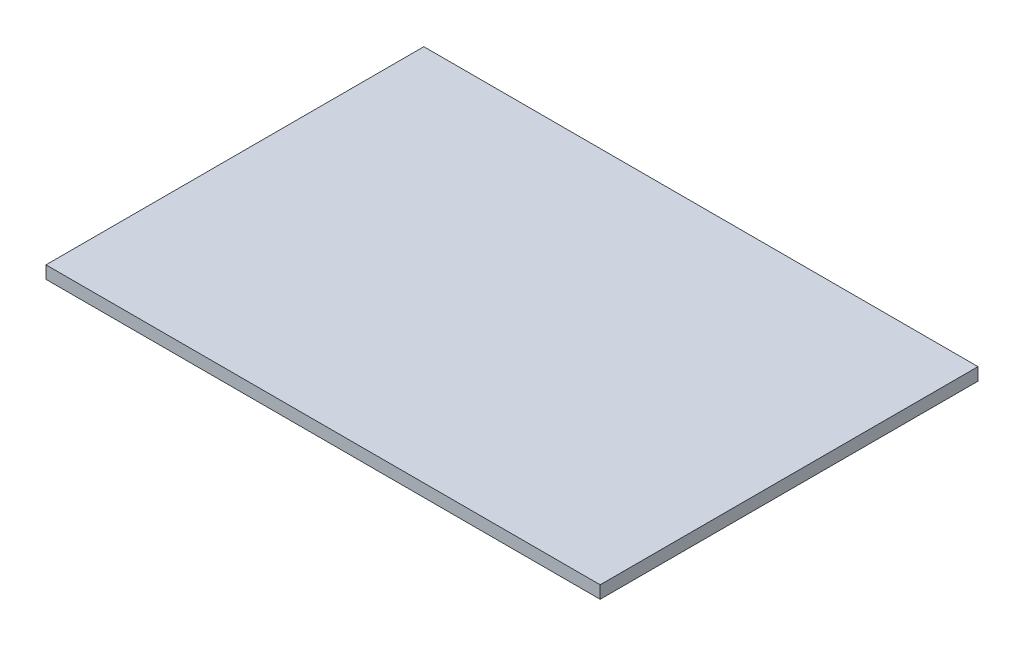
ISO-10303-21;
HEADER;
FILE_DESCRIPTION(('STEP AP214'),'2;1');
FILE_NAME('part.step','',(''),(''),'','','');
FILE_SCHEMA(('AUTOMOTIVE_DESIGN { 1 0 10303 214 1 1 1 1 }'));
ENDSEC;
DATA;
#1=APPLICATION_CONTEXT('core data for automotive mechanical design processes');
#2=APPLICATION_PROTOCOL_DEFINITION('international standard','automotive_design',2000,#1);
#3=PRODUCT_CONTEXT('',#1,'mechanical');
#4=PRODUCT('Part','Part','',(#3));
#5=PRODUCT_RELATED_PRODUCT_CATEGORY('part','',(#4));
#6=PRODUCT_DEFINITION_FORMATION('','',#4);
#7=PRODUCT_DEFINITION_CONTEXT('part definition',#1,'design');
#8=PRODUCT_DEFINITION('design','',#6,#7);
#9=PRODUCT_DEFINITION_SHAPE('','',#8);
#10=(LENGTH_UNIT() NAMED_UNIT(*) SI_UNIT(.MILLI.,.METRE.));
#11=(NAMED_UNIT(*) PLANE_ANGLE_UNIT() SI_UNIT($,.RADIAN.));
#12=(NAMED_UNIT(*) SI_UNIT($,.STERADIAN.) SOLID_ANGLE_UNIT());
#13=UNCERTAINTY_MEASURE_WITH_UNIT(LENGTH_MEASURE(1.E-05),#10,'distance_accuracy_value','');
#14=(GEOMETRIC_REPRESENTATION_CONTEXT(3) GLOBAL_UNCERTAINTY_ASSIGNED_CONTEXT((#13)) GLOBAL_UNIT_ASSIGNED_CONTEXT((#10,
#11,#12)) REPRESENTATION_CONTEXT('',''));
#15=CARTESIAN_POINT('',(0.,0.,0.));
#16=DIRECTION('',(0.,0.,1.));
#17=DIRECTION('',(1.,0.,0.));
#18=AXIS2_PLACEMENT_3D('',#15,#16,#17);
#19=CARTESIAN_POINT('',(88.,4.,60.));
#20=DIRECTION('',(-1.,0.,0.));
#21=DIRECTION('',(0.,0.,1.));
#22=AXIS2_PLACEMENT_3D('',#19,#20,#21);
#23=PLANE('',#22);
#24=DIRECTION('',(0.,0.,-1.));
#25=VECTOR('',#24,1.);
#26=CARTESIAN_POINT('',(88.,0.,60.));
#27=LINE('',#26,#25);
#28=CARTESIAN_POINT('',(88.,0.,60.));
#29=VERTEX_POINT('',#28);
#30=CARTESIAN_POINT('',(88.,0.,-60.));
#31=VERTEX_POINT('',#30);
#32=EDGE_CURVE('E98',#29,#31,#27,.T.);
#33=ORIENTED_EDGE('',*,*,#32,.T.);
#34=DIRECTION('',(0.,-1.,0.));
#35=VECTOR('',#34,1.);
#36=CARTESIAN_POINT('',(88.,4.,-60.));
#37=LINE('',#36,#35);
#38=CARTESIAN_POINT('',(88.,4.,-60.));
#39=VERTEX_POINT('',#38);
#40=EDGE_CURVE('E11',#39,#31,#37,.T.);
#41=ORIENTED_EDGE('',*,*,#40,.F.);
#42=DIRECTION('',(0.,0.,-1.));
#43=VECTOR('',#42,1.);
#44=CARTESIAN_POINT('',(88.,4.,60.));
#45=LINE('',#44,#43);
#46=CARTESIAN_POINT('',(88.,4.,60.));
#47=VERTEX_POINT('',#46);
#48=EDGE_CURVE('E86',#47,#39,#45,.T.);
#49=ORIENTED_EDGE('',*,*,#48,.F.);
#50=DIRECTION('',(0.,-1.,0.));
#51=VECTOR('',#50,1.);
#52=CARTESIAN_POINT('',(88.,4.,60.));
#53=LINE('',#52,#51);
#54=EDGE_CURVE('E94',#47,#29,#53,.T.);
#55=ORIENTED_EDGE('',*,*,#54,.T.);
#56=EDGE_LOOP('',(#33,#41,#49,#55));
#57=FACE_BOUND('',#56,.T.);
#58=ADVANCED_FACE('F35',(#57),#23,.F.);
#59=CARTESIAN_POINT('',(-88.,4.,-60.));
#60=DIRECTION('',(0.,0.,1.));
#61=DIRECTION('',(1.,0.,0.));
#62=AXIS2_PLACEMENT_3D('',#59,#60,#61);
#63=PLANE('',#62);
#64=DIRECTION('',(-1.,0.,0.));
#65=VECTOR('',#64,1.);
#66=CARTESIAN_POINT('',(-88.,0.,-60.));
#67=LINE('',#66,#65);
#68=CARTESIAN_POINT('',(-88.,0.,-60.));
#69=VERTEX_POINT('',#68);
#70=EDGE_CURVE('E90',#31,#69,#67,.T.);
#71=ORIENTED_EDGE('',*,*,#70,.T.);
#72=DIRECTION('',(0.,-1.,0.));
#73=VECTOR('',#72,1.);
#74=CARTESIAN_POINT('',(-88.,4.,-60.));
#75=LINE('',#74,#73);
#76=CARTESIAN_POINT('',(-88.,4.,-60.));
#77=VERTEX_POINT('',#76);
#78=EDGE_CURVE('E43',#77,#69,#75,.T.);
#79=ORIENTED_EDGE('',*,*,#78,.F.);
#80=DIRECTION('',(-1.,0.,0.));
#81=VECTOR('',#80,1.);
#82=CARTESIAN_POINT('',(-88.,4.,-60.));
#83=LINE('',#82,#81);
#84=EDGE_CURVE('E81',#39,#77,#83,.T.);
#85=ORIENTED_EDGE('',*,*,#84,.F.);
#86=ORIENTED_EDGE('',*,*,#40,.T.);
#87=EDGE_LOOP('',(#71,#79,#85,#86));
#88=FACE_BOUND('',#87,.T.);
#89=ADVANCED_FACE('F89',(#88),#63,.F.);
#90=CARTESIAN_POINT('',(-88.,4.,60.));
#91=DIRECTION('',(1.,0.,0.));
#92=DIRECTION('',(0.,0.,-1.));
#93=AXIS2_PLACEMENT_3D('',#90,#91,#92);
#94=PLANE('',#93);
#95=DIRECTION('',(0.,0.,1.));
#96=VECTOR('',#95,1.);
#97=CARTESIAN_POINT('',(-88.,0.,60.));
#98=LINE('',#97,#96);
#99=CARTESIAN_POINT('',(-88.,0.,60.));
#100=VERTEX_POINT('',#99);
#101=EDGE_CURVE('E68',#69,#100,#98,.T.);
#102=ORIENTED_EDGE('',*,*,#101,.T.);
#103=DIRECTION('',(0.,-1.,0.));
#104=VECTOR('',#103,1.);
#105=CARTESIAN_POINT('',(-88.,4.,60.));
#106=LINE('',#105,#104);
#107=CARTESIAN_POINT('',(-88.,4.,60.));
#108=VERTEX_POINT('',#107);
#109=EDGE_CURVE('E91',#108,#100,#106,.T.);
#110=ORIENTED_EDGE('',*,*,#109,.F.);
#111=DIRECTION('',(0.,0.,1.));
#112=VECTOR('',#111,1.);
#113=CARTESIAN_POINT('',(-88.,4.,60.));
#114=LINE('',#113,#112);
#115=EDGE_CURVE('E84',#77,#108,#114,.T.);
#116=ORIENTED_EDGE('',*,*,#115,.F.);
#117=ORIENTED_EDGE('',*,*,#78,.T.);
#118=EDGE_LOOP('',(#102,#110,#116,#117));
#119=FACE_BOUND('',#118,.T.);
#120=ADVANCED_FACE('F92',(#119),#94,.F.);
#121=CARTESIAN_POINT('',(-88.,4.,60.));
#122=DIRECTION('',(0.,0.,-1.));
#123=DIRECTION('',(-1.,0.,0.));
#124=AXIS2_PLACEMENT_3D('',#121,#122,#123);
#125=PLANE('',#124);
#126=DIRECTION('',(1.,0.,0.));
#127=VECTOR('',#126,1.);
#128=CARTESIAN_POINT('',(-88.,0.,60.));
#129=LINE('',#128,#127);
#130=EDGE_CURVE('E74',#100,#29,#129,.T.);
#131=ORIENTED_EDGE('',*,*,#130,.T.);
#132=ORIENTED_EDGE('',*,*,#54,.F.);
#133=DIRECTION('',(1.,0.,0.));
#134=VECTOR('',#133,1.);
#135=CARTESIAN_POINT('',(-88.,4.,60.));
#136=LINE('',#135,#134);
#137=EDGE_CURVE('E51',#108,#47,#136,.T.);
#138=ORIENTED_EDGE('',*,*,#137,.F.);
#139=ORIENTED_EDGE('',*,*,#109,.T.);
#140=EDGE_LOOP('',(#131,#132,#138,#139));
#141=FACE_BOUND('',#140,.T.);
#142=ADVANCED_FACE('F105',(#141),#125,.F.);
#143=CARTESIAN_POINT('',(0.,4.,0.));
#144=DIRECTION('',(0.,-1.,0.));
#145=DIRECTION('',(0.,0.,-1.));
#146=AXIS2_PLACEMENT_3D('',#143,#144,#145);
#147=PLANE('',#146);
#148=ORIENTED_EDGE('',*,*,#48,.T.);
#149=ORIENTED_EDGE('',*,*,#84,.T.);
#150=ORIENTED_EDGE('',*,*,#115,.T.);
#151=ORIENTED_EDGE('',*,*,#137,.T.);
#152=EDGE_LOOP('',(#148,#149,#150,#151));
#153=FACE_BOUND('',#152,.T.);
#154=ADVANCED_FACE('F82',(#153),#147,.F.);
#155=CARTESIAN_POINT('',(0.,0.,0.));
#156=DIRECTION('',(0.,-1.,0.));
#157=DIRECTION('',(0.,0.,-1.));
#158=AXIS2_PLACEMENT_3D('',#155,#156,#157);
#159=PLANE('',#158);
#160=ORIENTED_EDGE('',*,*,#32,.F.);
#161=ORIENTED_EDGE('',*,*,#130,.F.);
#162=ORIENTED_EDGE('',*,*,#101,.F.);
#163=ORIENTED_EDGE('',*,*,#70,.F.);
#164=EDGE_LOOP('',(#160,#161,#162,#163));
#165=FACE_BOUND('',#164,.T.);
#166=ADVANCED_FACE('F108',(#165),#159,.T.);
#167=CLOSED_SHELL('',(#58,#89,#120,#142,#154,#166));
#168=MANIFOLD_SOLID_BREP('B2',#167);
#169=ADVANCED_BREP_SHAPE_REPRESENTATION('',(#18,#168),#14);
#170=SHAPE_DEFINITION_REPRESENTATION(#9,#169);
ENDSEC;
END-ISO-10303-21;
